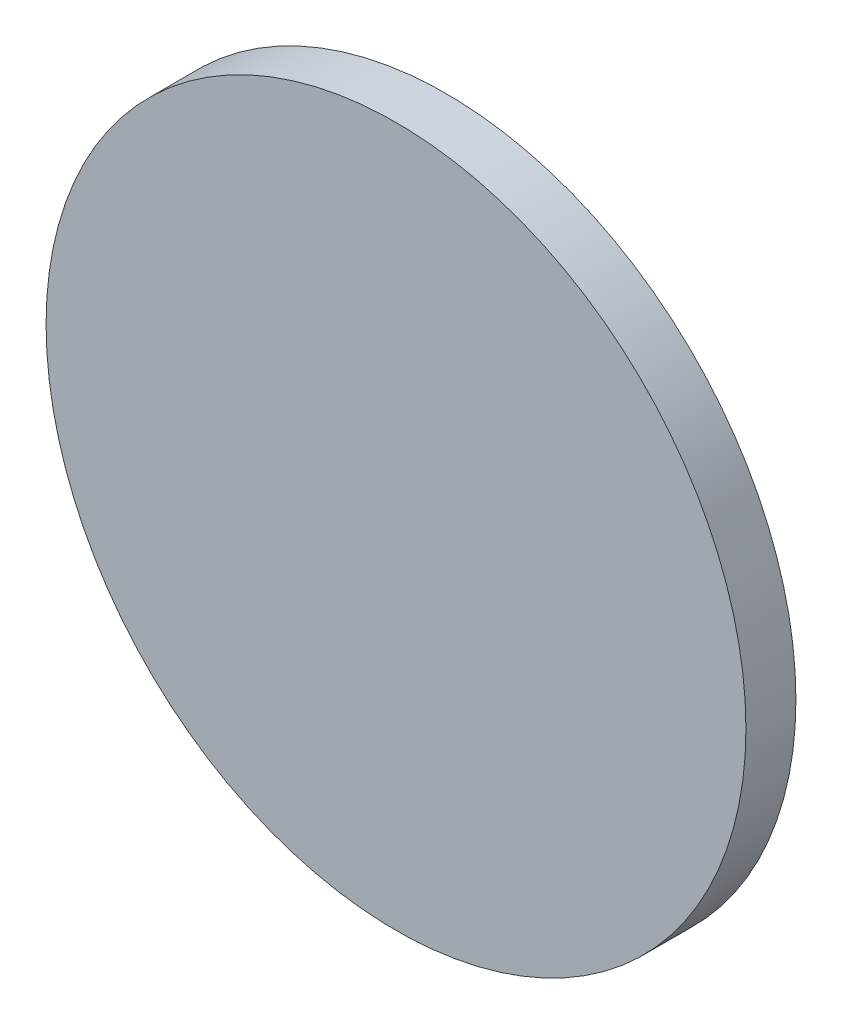
ISO-10303-21;
HEADER;
FILE_DESCRIPTION(('STEP AP214'),'2;1');
FILE_NAME('part.step','',(''),(''),'','','');
FILE_SCHEMA(('AUTOMOTIVE_DESIGN { 1 0 10303 214 1 1 1 1 }'));
ENDSEC;
DATA;
#1=APPLICATION_CONTEXT('core data for automotive mechanical design processes');
#2=APPLICATION_PROTOCOL_DEFINITION('international standard','automotive_design',2000,#1);
#3=PRODUCT_CONTEXT('',#1,'mechanical');
#4=PRODUCT('Part','Part','',(#3));
#5=PRODUCT_RELATED_PRODUCT_CATEGORY('part','',(#4));
#6=PRODUCT_DEFINITION_FORMATION('','',#4);
#7=PRODUCT_DEFINITION_CONTEXT('part definition',#1,'design');
#8=PRODUCT_DEFINITION('design','',#6,#7);
#9=PRODUCT_DEFINITION_SHAPE('','',#8);
#10=(LENGTH_UNIT() NAMED_UNIT(*) SI_UNIT(.MILLI.,.METRE.));
#11=(NAMED_UNIT(*) PLANE_ANGLE_UNIT() SI_UNIT($,.RADIAN.));
#12=(NAMED_UNIT(*) SI_UNIT($,.STERADIAN.) SOLID_ANGLE_UNIT());
#13=UNCERTAINTY_MEASURE_WITH_UNIT(LENGTH_MEASURE(1.E-05),#10,'distance_accuracy_value','');
#14=(GEOMETRIC_REPRESENTATION_CONTEXT(3) GLOBAL_UNCERTAINTY_ASSIGNED_CONTEXT((#13)) GLOBAL_UNIT_ASSIGNED_CONTEXT((#10,
#11,#12)) REPRESENTATION_CONTEXT('',''));
#15=CARTESIAN_POINT('',(0.,0.,0.));
#16=DIRECTION('',(0.,0.,1.));
#17=DIRECTION('',(1.,0.,0.));
#18=AXIS2_PLACEMENT_3D('',#15,#16,#17);
#19=CARTESIAN_POINT('',(21.84,102.16,-117.4902));
#20=DIRECTION('',(0.,0.,-1.));
#21=DIRECTION('',(-1.,0.,0.));
#22=AXIS2_PLACEMENT_3D('',#19,#20,#21);
#23=PLANE('',#22);
#24=CARTESIAN_POINT('',(0.,124.,-117.490200000033));
#25=DIRECTION('',(0.,0.,-1.));
#26=DIRECTION('',(-1.,0.,0.));
#27=AXIS2_PLACEMENT_3D('',#24,#25,#26);
#28=CIRCLE('',#27,21.);
#29=CARTESIAN_POINT('',(-21.,124.,-117.490200000033));
#30=VERTEX_POINT('',#29);
#31=EDGE_CURVE('E18',#30,#30,#28,.T.);
#32=ORIENTED_EDGE('',*,*,#31,.T.);
#33=EDGE_LOOP('',(#32));
#34=FACE_BOUND('',#33,.T.);
#35=ADVANCED_FACE('F14',(#34),#23,.T.);
#36=CARTESIAN_POINT('',(0.,124.,-114.490199999967));
#37=DIRECTION('',(0.,0.,-1.));
#38=DIRECTION('',(-1.,0.,0.));
#39=AXIS2_PLACEMENT_3D('',#36,#37,#38);
#40=CYLINDRICAL_SURFACE('',#39,21.);
#41=ORIENTED_EDGE('',*,*,#31,.F.);
#42=EDGE_LOOP('',(#41));
#43=FACE_BOUND('',#42,.T.);
#44=CARTESIAN_POINT('',(0.,124.,-114.490199999967));
#45=DIRECTION('',(0.,0.,-1.));
#46=DIRECTION('',(-1.,0.,0.));
#47=AXIS2_PLACEMENT_3D('',#44,#45,#46);
#48=CIRCLE('',#47,21.);
#49=CARTESIAN_POINT('',(-21.,124.,-114.490199999967));
#50=VERTEX_POINT('',#49);
#51=EDGE_CURVE('E10',#50,#50,#48,.T.);
#52=ORIENTED_EDGE('',*,*,#51,.T.);
#53=EDGE_LOOP('',(#52));
#54=FACE_BOUND('',#53,.T.);
#55=ADVANCED_FACE('F28',(#43,#54),#40,.T.);
#56=CARTESIAN_POINT('',(21.84,102.16,-114.4902));
#57=DIRECTION('',(0.,0.,-1.));
#58=DIRECTION('',(-1.,0.,0.));
#59=AXIS2_PLACEMENT_3D('',#56,#57,#58);
#60=PLANE('',#59);
#61=ORIENTED_EDGE('',*,*,#51,.F.);
#62=EDGE_LOOP('',(#61));
#63=FACE_BOUND('',#62,.T.);
#64=ADVANCED_FACE('F16',(#63),#60,.F.);
#65=CLOSED_SHELL('',(#35,#55,#64));
#66=MANIFOLD_SOLID_BREP('B1',#65);
#67=ADVANCED_BREP_SHAPE_REPRESENTATION('',(#18,#66),#14);
#68=SHAPE_DEFINITION_REPRESENTATION(#9,#67);
ENDSEC;
END-ISO-10303-21;
